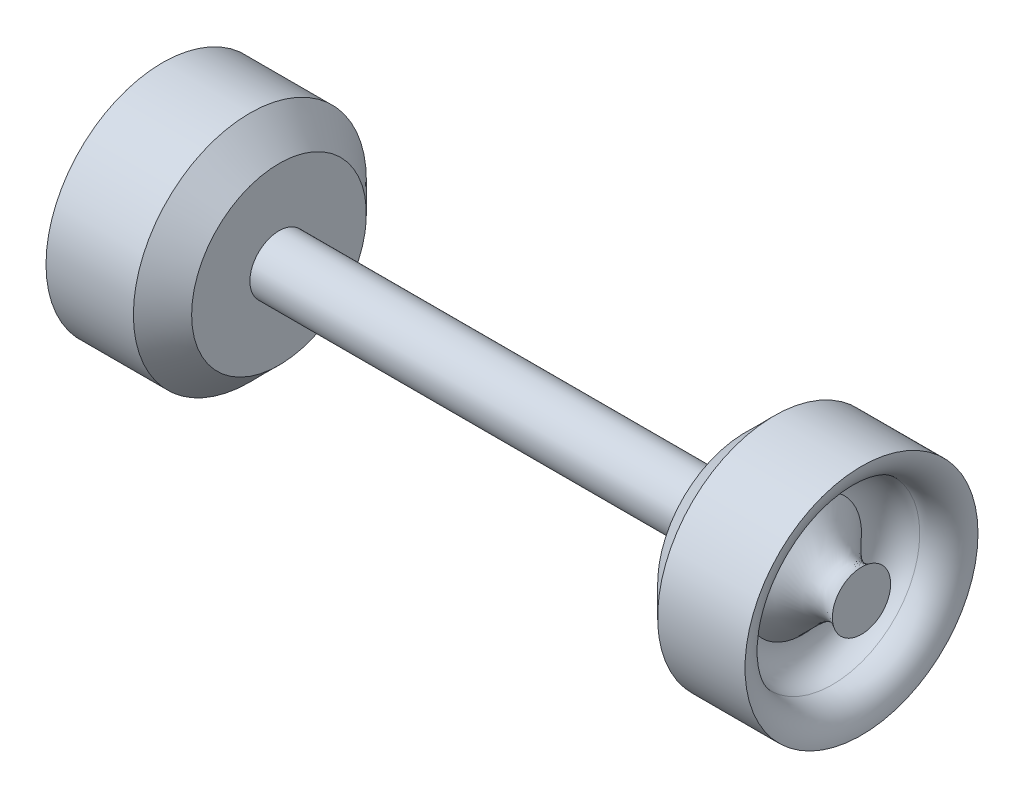
ISO-10303-21;
HEADER;
FILE_DESCRIPTION(('STEP AP214'),'2;1');
FILE_NAME('part.step','',(''),(''),'','','');
FILE_SCHEMA(('AUTOMOTIVE_DESIGN { 1 0 10303 214 1 1 1 1 }'));
ENDSEC;
DATA;
#1=APPLICATION_CONTEXT('core data for automotive mechanical design processes');
#2=APPLICATION_PROTOCOL_DEFINITION('international standard','automotive_design',2000,#1);
#3=PRODUCT_CONTEXT('',#1,'mechanical');
#4=PRODUCT('Part','Part','',(#3));
#5=PRODUCT_RELATED_PRODUCT_CATEGORY('part','',(#4));
#6=PRODUCT_DEFINITION_FORMATION('','',#4);
#7=PRODUCT_DEFINITION_CONTEXT('part definition',#1,'design');
#8=PRODUCT_DEFINITION('design','',#6,#7);
#9=PRODUCT_DEFINITION_SHAPE('','',#8);
#10=(LENGTH_UNIT() NAMED_UNIT(*) SI_UNIT(.MILLI.,.METRE.));
#11=(NAMED_UNIT(*) PLANE_ANGLE_UNIT() SI_UNIT($,.RADIAN.));
#12=(NAMED_UNIT(*) SI_UNIT($,.STERADIAN.) SOLID_ANGLE_UNIT());
#13=UNCERTAINTY_MEASURE_WITH_UNIT(LENGTH_MEASURE(1.E-05),#10,'distance_accuracy_value','');
#14=(GEOMETRIC_REPRESENTATION_CONTEXT(3) GLOBAL_UNCERTAINTY_ASSIGNED_CONTEXT((#13)) GLOBAL_UNIT_ASSIGNED_CONTEXT((#10,
#11,#12)) REPRESENTATION_CONTEXT('',''));
#15=CARTESIAN_POINT('',(0.,0.,0.));
#16=DIRECTION('',(0.,0.,1.));
#17=DIRECTION('',(1.,0.,0.));
#18=AXIS2_PLACEMENT_3D('',#15,#16,#17);
#19=CARTESIAN_POINT('',(20.,0.,0.));
#20=DIRECTION('',(-1.,0.,0.));
#21=DIRECTION('',(0.,0.,1.));
#22=AXIS2_PLACEMENT_3D('',#19,#20,#21);
#23=CYLINDRICAL_SURFACE('',#22,2.5);
#24=CARTESIAN_POINT('',(20.,0.,0.));
#25=DIRECTION('',(1.,0.,0.));
#26=DIRECTION('',(0.,0.,-1.));
#27=AXIS2_PLACEMENT_3D('',#24,#25,#26);
#28=CIRCLE('',#27,2.5);
#29=CARTESIAN_POINT('',(20.,0.,-2.5));
#30=VERTEX_POINT('',#29);
#31=EDGE_CURVE('E129',#30,#30,#28,.T.);
#32=ORIENTED_EDGE('',*,*,#31,.F.);
#33=EDGE_LOOP('',(#32));
#34=FACE_BOUND('',#33,.T.);
#35=CARTESIAN_POINT('',(-20.,0.,0.));
#36=DIRECTION('',(1.,0.,0.));
#37=DIRECTION('',(0.,0.,-1.));
#38=AXIS2_PLACEMENT_3D('',#35,#36,#37);
#39=CIRCLE('',#38,2.5);
#40=CARTESIAN_POINT('',(-20.,0.,-2.5));
#41=VERTEX_POINT('',#40);
#42=EDGE_CURVE('E140',#41,#41,#39,.T.);
#43=ORIENTED_EDGE('',*,*,#42,.T.);
#44=EDGE_LOOP('',(#43));
#45=FACE_BOUND('',#44,.T.);
#46=ADVANCED_FACE('F36',(#34,#45),#23,.T.);
#47=CARTESIAN_POINT('',(30.,0.,0.));
#48=DIRECTION('',(-1.,0.,0.));
#49=DIRECTION('',(0.,0.,1.));
#50=AXIS2_PLACEMENT_3D('',#47,#48,#49);
#51=CYLINDRICAL_SURFACE('',#50,10.);
#52=CARTESIAN_POINT('',(22.5,0.,0.));
#53=DIRECTION('',(1.,0.,0.));
#54=DIRECTION('',(0.,0.,-1.));
#55=AXIS2_PLACEMENT_3D('',#52,#53,#54);
#56=CIRCLE('',#55,10.);
#57=CARTESIAN_POINT('',(22.5,0.,-10.));
#58=VERTEX_POINT('',#57);
#59=EDGE_CURVE('E43',#58,#58,#56,.T.);
#60=ORIENTED_EDGE('',*,*,#59,.T.);
#61=EDGE_LOOP('',(#60));
#62=FACE_BOUND('',#61,.T.);
#63=CARTESIAN_POINT('',(30.,0.,0.));
#64=DIRECTION('',(1.,0.,0.));
#65=DIRECTION('',(0.,0.,-1.));
#66=AXIS2_PLACEMENT_3D('',#63,#64,#65);
#67=CIRCLE('',#66,10.);
#68=CARTESIAN_POINT('',(30.,0.,-10.));
#69=VERTEX_POINT('',#68);
#70=EDGE_CURVE('E132',#69,#69,#67,.T.);
#71=ORIENTED_EDGE('',*,*,#70,.F.);
#72=EDGE_LOOP('',(#71));
#73=FACE_BOUND('',#72,.T.);
#74=ADVANCED_FACE('F88',(#62,#73),#51,.T.);
#75=CARTESIAN_POINT('',(20.,0.,0.));
#76=DIRECTION('',(1.,0.,0.));
#77=DIRECTION('',(0.,0.,-1.));
#78=AXIS2_PLACEMENT_3D('',#75,#76,#77);
#79=PLANE('',#78);
#80=CARTESIAN_POINT('',(20.,0.,0.));
#81=DIRECTION('',(1.,0.,0.));
#82=DIRECTION('',(0.,0.,-1.));
#83=AXIS2_PLACEMENT_3D('',#80,#81,#82);
#84=CIRCLE('',#83,7.49999999999997);
#85=CARTESIAN_POINT('',(20.,0.,-7.49999999999997));
#86=VERTEX_POINT('',#85);
#87=EDGE_CURVE('E11',#86,#86,#84,.F.);
#88=ORIENTED_EDGE('',*,*,#87,.T.);
#89=EDGE_LOOP('',(#88));
#90=FACE_BOUND('',#89,.T.);
#91=ORIENTED_EDGE('',*,*,#31,.T.);
#92=EDGE_LOOP('',(#91));
#93=FACE_BOUND('',#92,.T.);
#94=ADVANCED_FACE('F94',(#90,#93),#79,.F.);
#95=CARTESIAN_POINT('',(30.,0.,0.));
#96=DIRECTION('',(1.,0.,0.));
#97=DIRECTION('',(0.,0.,-1.));
#98=AXIS2_PLACEMENT_3D('',#95,#96,#97);
#99=PLANE('',#98);
#100=CARTESIAN_POINT('',(30.,0.,0.));
#101=DIRECTION('',(1.,0.,0.));
#102=DIRECTION('',(0.,0.,-1.));
#103=AXIS2_PLACEMENT_3D('',#100,#101,#102);
#104=CIRCLE('',#103,2.5);
#105=CARTESIAN_POINT('',(30.,2.33916485240125,0.882217543064436));
#106=VERTEX_POINT('',#105);
#107=EDGE_CURVE('E135',#106,#106,#104,.T.);
#108=ORIENTED_EDGE('',*,*,#107,.T.);
#109=EDGE_LOOP('',(#108));
#110=FACE_BOUND('',#109,.T.);
#111=ADVANCED_FACE('F146',(#110),#99,.T.);
#112=CARTESIAN_POINT('',(30.,2.33916485240125,0.882217543064436));
#113=CARTESIAN_POINT('',(25.,0.918384280565023,-4.91493339865466));
#114=CARTESIAN_POINT('',(30.,4.10359993853012,-3.79611216173806));
#115=CARTESIAN_POINT('',(25.,-8.9114825167443,-6.75170195978471));
#116=CARTESIAN_POINT('',(30.,-0.574729766272376,-5.56054724786693));
#117=CARTESIAN_POINT('',(25.,-10.7482510778743,3.07816483752462));
#118=CARTESIAN_POINT('',(30.,-2.33916485240125,-0.882217543064436));
#119=CARTESIAN_POINT('',(25.,-0.918384280565022,4.91493339865466));
#120=CARTESIAN_POINT('',(30.,-4.10359993853012,3.79611216173806));
#121=CARTESIAN_POINT('',(25.,8.9114825167443,6.75170195978471));
#122=CARTESIAN_POINT('',(30.,0.574729766272374,5.56054724786693));
#123=CARTESIAN_POINT('',(25.,10.7482510778743,-3.07816483752462));
#124=CARTESIAN_POINT('',(30.,2.33916485240125,0.882217543064436));
#125=CARTESIAN_POINT('',(25.,0.918384280565023,-4.91493339865466));
#126=(BOUNDED_SURFACE() B_SPLINE_SURFACE(3,1,((#112,#113),(#114,#115),(#116,#117),(#118,#119),
(#120,#121),(#122,#123),(#124,#125)),.UNSPECIFIED.,.T.,.F.,.F.) B_SPLINE_SURFACE_WITH_KNOTS((4,
3,4),(2,2),(0.,0.5,1.),(0.,1.),
.UNSPECIFIED.) GEOMETRIC_REPRESENTATION_ITEM() RATIONAL_B_SPLINE_SURFACE(((1.,1.),
(0.333333333333333,0.333333333333333),(0.333333333333333,0.333333333333333),(1.,1.),
(0.333333333333334,0.333333333333333),(0.333333333333334,0.333333333333333),(1.,1.))) REPRESENTATION_ITEM('') SURFACE());
#127=CARTESIAN_POINT('',(25.,0.,0.));
#128=DIRECTION('',(-1.,0.,0.));
#129=DIRECTION('',(0.,0.,1.));
#130=AXIS2_PLACEMENT_3D('',#127,#128,#129);
#131=CIRCLE('',#130,5.);
#132=CARTESIAN_POINT('',(25.,0.918384280565023,-4.91493339865466));
#133=VERTEX_POINT('',#132);
#134=EDGE_CURVE('E115',#133,#133,#131,.F.);
#135=CARTESIAN_POINT('',(30.,2.33916485240125,0.882217543064436));
#136=CARTESIAN_POINT('',(29.9479166666667,2.32436505477795,0.821830554088195));
#137=CARTESIAN_POINT('',(29.8958333333333,2.30956525715466,0.761443565111955));
#138=CARTESIAN_POINT('',(29.7916666666667,2.27996566190807,0.640669587159474));
#139=CARTESIAN_POINT('',(29.7395833333333,2.26516586428478,0.580282598183233));
#140=CARTESIAN_POINT('',(29.6354166666667,2.23556626903819,0.459508620230752));
#141=CARTESIAN_POINT('',(29.5833333333333,2.2207664714149,0.399121631254511));
#142=CARTESIAN_POINT('',(29.4791666666667,2.19116687616831,0.27834765330203));
#143=CARTESIAN_POINT('',(29.4270833333333,2.17636707854501,0.217960664325789));
#144=CARTESIAN_POINT('',(29.3229166666667,2.14676748329843,0.0971866863733083));
#145=CARTESIAN_POINT('',(29.2708333333333,2.13196768567513,0.0367996973970679));
#146=CARTESIAN_POINT('',(29.1666666666667,2.10236809042854,-0.0839742805554133));
#147=CARTESIAN_POINT('',(29.1145833333333,2.08756829280525,-0.144361269531654));
#148=CARTESIAN_POINT('',(29.0104166666667,2.05796869755866,-0.265135247484136));
#149=CARTESIAN_POINT('',(28.9583333333333,2.04316889993537,-0.325522236460377));
#150=CARTESIAN_POINT('',(28.8541666666667,2.01356930468878,-0.446296214412857));
#151=CARTESIAN_POINT('',(28.8020833333333,1.99876950706549,-0.506683203389098));
#152=CARTESIAN_POINT('',(28.6979166666667,1.9691699118189,-0.627457181341579));
#153=CARTESIAN_POINT('',(28.6458333333333,1.9543701141956,-0.68784417031782));
#154=CARTESIAN_POINT('',(28.5416666666667,1.92477051894902,-0.808618148270301));
#155=CARTESIAN_POINT('',(28.4895833333333,1.90997072132572,-0.869005137246541));
#156=CARTESIAN_POINT('',(28.3854166666667,1.88037112607913,-0.989779115199023));
#157=CARTESIAN_POINT('',(28.3333333333333,1.86557132845584,-1.05016610417526));
#158=CARTESIAN_POINT('',(28.2291666666667,1.83597173320925,-1.17094008212774));
#159=CARTESIAN_POINT('',(28.1770833333333,1.82117193558596,-1.23132707110398));
#160=CARTESIAN_POINT('',(28.0729166666667,1.79157234033937,-1.35210104905647));
#161=CARTESIAN_POINT('',(28.0208333333333,1.77677254271608,-1.41248803803271));
#162=CARTESIAN_POINT('',(27.9166666666667,1.74717294746949,-1.53326201598519));
#163=CARTESIAN_POINT('',(27.8645833333333,1.73237314984619,-1.59364900496143));
#164=CARTESIAN_POINT('',(27.7604166666667,1.7027735545996,-1.71442298291391));
#165=CARTESIAN_POINT('',(27.7083333333333,1.68797375697631,-1.77480997189015));
#166=CARTESIAN_POINT('',(27.6041666666667,1.65837416172972,-1.89558394984263));
#167=CARTESIAN_POINT('',(27.5520833333333,1.64357436410643,-1.95597093881887));
#168=CARTESIAN_POINT('',(27.4479166666667,1.61397476885984,-2.07674491677135));
#169=CARTESIAN_POINT('',(27.3958333333333,1.59917497123655,-2.13713190574759));
#170=CARTESIAN_POINT('',(27.2916666666667,1.56957537598996,-2.25790588370008));
#171=CARTESIAN_POINT('',(27.2395833333333,1.55477557836667,-2.31829287267632));
#172=CARTESIAN_POINT('',(27.1354166666667,1.52517598312008,-2.4390668506288));
#173=CARTESIAN_POINT('',(27.0833333333333,1.51037618549678,-2.49945383960504));
#174=CARTESIAN_POINT('',(26.9791666666667,1.48077659025019,-2.62022781755752));
#175=CARTESIAN_POINT('',(26.9270833333333,1.4659767926269,-2.68061480653376));
#176=CARTESIAN_POINT('',(26.8229166666667,1.43637719738031,-2.80138878448624));
#177=CARTESIAN_POINT('',(26.7708333333333,1.42157739975702,-2.86177577346248));
#178=CARTESIAN_POINT('',(26.6666666666667,1.39197780451043,-2.98254975141496));
#179=CARTESIAN_POINT('',(26.6145833333333,1.37717800688714,-3.0429367403912));
#180=CARTESIAN_POINT('',(26.5104166666667,1.34757841164055,-3.16371071834368));
#181=CARTESIAN_POINT('',(26.4583333333333,1.33277861401726,-3.22409770731993));
#182=CARTESIAN_POINT('',(26.3541666666667,1.30317901877067,-3.34487168527241));
#183=CARTESIAN_POINT('',(26.3020833333333,1.28837922114737,-3.40525867424865));
#184=CARTESIAN_POINT('',(26.1979166666667,1.25877962590079,-3.52603265220113));
#185=CARTESIAN_POINT('',(26.1458333333333,1.24397982827749,-3.58641964117737));
#186=CARTESIAN_POINT('',(26.0416666666667,1.2143802330309,-3.70719361912985));
#187=CARTESIAN_POINT('',(25.9895833333333,1.19958043540761,-3.76758060810609));
#188=CARTESIAN_POINT('',(25.8854166666667,1.16998084016102,-3.88835458605857));
#189=CARTESIAN_POINT('',(25.8333333333333,1.15518104253773,-3.94874157503481));
#190=CARTESIAN_POINT('',(25.7291666666667,1.12558144729114,-4.06951555298729));
#191=CARTESIAN_POINT('',(25.6770833333333,1.11078164966785,-4.12990254196353));
#192=CARTESIAN_POINT('',(25.5729166666667,1.08118205442126,-4.25067651991601));
#193=CARTESIAN_POINT('',(25.5208333333333,1.06638225679796,-4.31106350889226));
#194=CARTESIAN_POINT('',(25.4166666666667,1.03678266155138,-4.43183748684474));
#195=CARTESIAN_POINT('',(25.3645833333333,1.02198286392808,-4.49222447582098));
#196=CARTESIAN_POINT('',(25.2604166666667,0.992383268681493,-4.61299845377346));
#197=CARTESIAN_POINT('',(25.2083333333333,0.977583471058199,-4.6733854427497));
#198=CARTESIAN_POINT('',(25.1041666666667,0.947983875811611,-4.79415942070218));
#199=CARTESIAN_POINT('',(25.0520833333333,0.933184078188317,-4.85454640967842));
#200=CARTESIAN_POINT('',(25.,0.918384280565023,-4.91493339865466));
#201=B_SPLINE_CURVE_WITH_KNOTS('',3,(#135,#136,#137,#138,#139,#140,#141,#142,#143,#144,#145,
#146,#147,#148,#149,#150,#151,#152,#153,#154,#155,#156,#157,#158,#159,#160,#161,#162,#163,#164,
#165,#166,#167,#168,#169,#170,#171,#172,#173,#174,#175,#176,#177,#178,#179,#180,#181,#182,#183,
#184,#185,#186,#187,#188,#189,#190,#191,#192,#193,#194,#195,#196,#197,#198,#199,#200),
.UNSPECIFIED.,.F.,.F.,(4,2,2,2,2,2,2,2,2,2,2,2,2,2,2,2,2,2,2,2,2,2,2,2,2,2,2,2,2,2,2,2,4),(0.,
0.243320086564516,0.486640173129032,0.729960259693548,0.973280346258064,1.21660043282258,
1.45992051938709,1.70324060595161,1.94656069251613,2.18988077908065,2.43320086564516,
2.67652095220968,2.91984103877419,3.16316112533871,3.40648121190322,3.64980129846774,
3.89312138503226,4.13644147159677,4.37976155816129,4.6230816447258,4.86640173129032,
5.10972181785484,5.35304190441935,5.59636199098387,5.83968207754838,6.0830021641129,
6.32632225067742,6.56964233724193,6.81296242380645,7.05628251037096,7.29960259693548,
7.5429226835,7.78624277006451),.UNSPECIFIED.);
#202=EDGE_CURVE('BSEAM156',#106,#133,#201,.T.);
#203=ORIENTED_EDGE('',*,*,#107,.F.);
#204=ORIENTED_EDGE('',*,*,#134,.T.);
#205=ORIENTED_EDGE('',*,*,#202,.T.);
#206=ORIENTED_EDGE('',*,*,#202,.F.);
#207=EDGE_LOOP('',(#203,#205,#204,#206));
#208=FACE_BOUND('',#207,.T.);
#209=ADVANCED_FACE('F156',(#208),#126,.T.);
#210=CARTESIAN_POINT('',(-30.,0.,0.));
#211=DIRECTION('',(1.,0.,0.));
#212=DIRECTION('',(0.,0.,-1.));
#213=AXIS2_PLACEMENT_3D('',#210,#211,#212);
#214=CYLINDRICAL_SURFACE('',#213,10.);
#215=CARTESIAN_POINT('',(-22.5,0.,0.));
#216=DIRECTION('',(-1.,0.,0.));
#217=DIRECTION('',(0.,0.,1.));
#218=AXIS2_PLACEMENT_3D('',#215,#216,#217);
#219=CIRCLE('',#218,10.);
#220=CARTESIAN_POINT('',(-22.5,0.,10.));
#221=VERTEX_POINT('',#220);
#222=EDGE_CURVE('E47',#221,#221,#219,.T.);
#223=ORIENTED_EDGE('',*,*,#222,.T.);
#224=EDGE_LOOP('',(#223));
#225=FACE_BOUND('',#224,.T.);
#226=CARTESIAN_POINT('',(-30.,0.,0.));
#227=DIRECTION('',(1.,0.,0.));
#228=DIRECTION('',(0.,0.,-1.));
#229=AXIS2_PLACEMENT_3D('',#226,#227,#228);
#230=CIRCLE('',#229,10.);
#231=CARTESIAN_POINT('',(-30.,0.,-10.));
#232=VERTEX_POINT('',#231);
#233=EDGE_CURVE('E124',#232,#232,#230,.T.);
#234=ORIENTED_EDGE('',*,*,#233,.T.);
#235=EDGE_LOOP('',(#234));
#236=FACE_BOUND('',#235,.T.);
#237=ADVANCED_FACE('F158',(#225,#236),#214,.T.);
#238=CARTESIAN_POINT('',(-20.,0.,0.));
#239=DIRECTION('',(-1.,0.,0.));
#240=DIRECTION('',(0.,0.,-1.));
#241=AXIS2_PLACEMENT_3D('',#238,#239,#240);
#242=PLANE('',#241);
#243=CARTESIAN_POINT('',(-20.,0.,0.));
#244=DIRECTION('',(-1.,0.,0.));
#245=DIRECTION('',(0.,0.,1.));
#246=AXIS2_PLACEMENT_3D('',#243,#244,#245);
#247=CIRCLE('',#246,7.5);
#248=CARTESIAN_POINT('',(-20.,0.,7.5));
#249=VERTEX_POINT('',#248);
#250=EDGE_CURVE('E51',#249,#249,#247,.F.);
#251=ORIENTED_EDGE('',*,*,#250,.T.);
#252=EDGE_LOOP('',(#251));
#253=FACE_BOUND('',#252,.T.);
#254=ORIENTED_EDGE('',*,*,#42,.F.);
#255=EDGE_LOOP('',(#254));
#256=FACE_BOUND('',#255,.T.);
#257=ADVANCED_FACE('F199',(#253,#256),#242,.F.);
#258=CARTESIAN_POINT('',(-30.,0.,0.));
#259=DIRECTION('',(-1.,0.,0.));
#260=DIRECTION('',(0.,0.,-1.));
#261=AXIS2_PLACEMENT_3D('',#258,#259,#260);
#262=PLANE('',#261);
#263=CARTESIAN_POINT('',(-30.,0.,0.));
#264=DIRECTION('',(1.,0.,0.));
#265=DIRECTION('',(0.,0.,-1.));
#266=AXIS2_PLACEMENT_3D('',#263,#264,#265);
#267=CIRCLE('',#266,2.5);
#268=CARTESIAN_POINT('',(-30.,0.,-2.5));
#269=VERTEX_POINT('',#268);
#270=EDGE_CURVE('E120',#269,#269,#267,.T.);
#271=ORIENTED_EDGE('',*,*,#270,.F.);
#272=EDGE_LOOP('',(#271));
#273=FACE_BOUND('',#272,.T.);
#274=ADVANCED_FACE('F109',(#273),#262,.T.);
#275=CARTESIAN_POINT('',(-30.,2.33916485240125,0.882217543064436));
#276=CARTESIAN_POINT('',(-25.,0.918384280565023,-4.91493339865466));
#277=CARTESIAN_POINT('',(-30.,4.10359993853012,-3.79611216173806));
#278=CARTESIAN_POINT('',(-25.,-8.9114825167443,-6.75170195978471));
#279=CARTESIAN_POINT('',(-30.,-0.574729766272376,-5.56054724786693));
#280=CARTESIAN_POINT('',(-25.,-10.7482510778743,3.07816483752462));
#281=CARTESIAN_POINT('',(-30.,-2.33916485240125,-0.882217543064436));
#282=CARTESIAN_POINT('',(-25.,-0.918384280565022,4.91493339865466));
#283=CARTESIAN_POINT('',(-30.,-4.10359993853012,3.79611216173806));
#284=CARTESIAN_POINT('',(-25.,8.9114825167443,6.75170195978471));
#285=CARTESIAN_POINT('',(-30.,0.574729766272374,5.56054724786693));
#286=CARTESIAN_POINT('',(-25.,10.7482510778743,-3.07816483752462));
#287=CARTESIAN_POINT('',(-30.,2.33916485240125,0.882217543064436));
#288=CARTESIAN_POINT('',(-25.,0.918384280565023,-4.91493339865466));
#289=(BOUNDED_SURFACE() B_SPLINE_SURFACE(3,1,((#275,#276),(#277,#278),(#279,#280),(#281,#282),
(#283,#284),(#285,#286),(#287,#288)),.UNSPECIFIED.,.T.,.F.,.F.) B_SPLINE_SURFACE_WITH_KNOTS((4,
3,4),(2,2),(0.,0.5,1.),(0.,1.),
.UNSPECIFIED.) GEOMETRIC_REPRESENTATION_ITEM() RATIONAL_B_SPLINE_SURFACE(((1.,1.),
(0.333333333333333,0.333333333333333),(0.333333333333333,0.333333333333333),(1.,1.),
(0.333333333333334,0.333333333333333),(0.333333333333334,0.333333333333333),(1.,1.))) REPRESENTATION_ITEM('') SURFACE());
#290=CARTESIAN_POINT('',(-25.,0.918384280565023,-4.91493339865466));
#291=CARTESIAN_POINT('',(-25.,-8.9114825167443,-6.75170195978471));
#292=CARTESIAN_POINT('',(-25.,-10.7482510778743,3.07816483752462));
#293=CARTESIAN_POINT('',(-25.,-0.918384280565022,4.91493339865466));
#294=CARTESIAN_POINT('',(-25.,8.9114825167443,6.75170195978471));
#295=CARTESIAN_POINT('',(-25.,10.7482510778743,-3.07816483752462));
#296=CARTESIAN_POINT('',(-25.,0.918384280565023,-4.91493339865466));
#297=(BOUNDED_CURVE() B_SPLINE_CURVE(3,(#290,#291,#292,#293,#294,#295,#296),.UNSPECIFIED.,.T.,
.F.) B_SPLINE_CURVE_WITH_KNOTS((4,3,4),(0.,0.5,1.),
.UNSPECIFIED.) CURVE() GEOMETRIC_REPRESENTATION_ITEM() RATIONAL_B_SPLINE_CURVE((1.,
0.333333333333333,0.333333333333333,1.,0.333333333333333,0.333333333333333,1.)) REPRESENTATION_ITEM(''));
#298=CARTESIAN_POINT('',(-25.,5.,0.));
#299=VERTEX_POINT('',#298);
#300=EDGE_CURVE('E56',#299,#299,#297,.T.);
#301=ORIENTED_EDGE('',*,*,#270,.T.);
#302=EDGE_LOOP('',(#301));
#303=FACE_BOUND('',#302,.T.);
#304=ORIENTED_EDGE('',*,*,#300,.T.);
#305=EDGE_LOOP('',(#304));
#306=FACE_BOUND('',#305,.T.);
#307=ADVANCED_FACE('F104',(#303,#306),#289,.F.);
#308=CARTESIAN_POINT('',(27.5,0.,0.));
#309=DIRECTION('',(1.,0.,0.));
#310=DIRECTION('',(0.,0.,-1.));
#311=AXIS2_PLACEMENT_3D('',#308,#309,#310);
#312=TOROIDAL_SURFACE('',#311,5.,2.5);
#313=ORIENTED_EDGE('',*,*,#134,.F.);
#314=EDGE_LOOP('',(#313));
#315=FACE_BOUND('',#314,.T.);
#316=CARTESIAN_POINT('',(27.5,0.,0.));
#317=DIRECTION('',(1.,0.,0.));
#318=DIRECTION('',(0.,0.,-1.));
#319=AXIS2_PLACEMENT_3D('',#316,#317,#318);
#320=CIRCLE('',#319,7.5);
#321=CARTESIAN_POINT('',(27.5,0.,-7.5));
#322=VERTEX_POINT('',#321);
#323=EDGE_CURVE('E118',#322,#322,#320,.F.);
#324=ORIENTED_EDGE('',*,*,#323,.F.);
#325=EDGE_LOOP('',(#324));
#326=FACE_BOUND('',#325,.T.);
#327=ADVANCED_FACE('F101',(#315,#326),#312,.F.);
#328=CARTESIAN_POINT('',(27.5,0.,0.));
#329=DIRECTION('',(1.,0.,0.));
#330=DIRECTION('',(0.,0.,-1.));
#331=AXIS2_PLACEMENT_3D('',#328,#329,#330);
#332=TOROIDAL_SURFACE('',#331,10.,2.5);
#333=ORIENTED_EDGE('',*,*,#70,.T.);
#334=EDGE_LOOP('',(#333));
#335=FACE_BOUND('',#334,.T.);
#336=ORIENTED_EDGE('',*,*,#323,.T.);
#337=EDGE_LOOP('',(#336));
#338=FACE_BOUND('',#337,.T.);
#339=ADVANCED_FACE('F73',(#335,#338),#332,.T.);
#340=CARTESIAN_POINT('',(-27.5,0.,0.));
#341=DIRECTION('',(-1.,0.,0.));
#342=DIRECTION('',(0.,0.,1.));
#343=AXIS2_PLACEMENT_3D('',#340,#341,#342);
#344=TOROIDAL_SURFACE('',#343,5.,2.5);
#345=ORIENTED_EDGE('',*,*,#300,.F.);
#346=EDGE_LOOP('',(#345));
#347=FACE_BOUND('',#346,.T.);
#348=CARTESIAN_POINT('',(-27.5,0.,0.));
#349=DIRECTION('',(-1.,0.,0.));
#350=DIRECTION('',(0.,0.,1.));
#351=AXIS2_PLACEMENT_3D('',#348,#349,#350);
#352=CIRCLE('',#351,7.5);
#353=CARTESIAN_POINT('',(-27.5,0.,7.5));
#354=VERTEX_POINT('',#353);
#355=EDGE_CURVE('E121',#354,#354,#352,.F.);
#356=ORIENTED_EDGE('',*,*,#355,.F.);
#357=EDGE_LOOP('',(#356));
#358=FACE_BOUND('',#357,.T.);
#359=ADVANCED_FACE('F63',(#347,#358),#344,.F.);
#360=CARTESIAN_POINT('',(-27.5,0.,0.));
#361=DIRECTION('',(-1.,0.,0.));
#362=DIRECTION('',(0.,0.,1.));
#363=AXIS2_PLACEMENT_3D('',#360,#361,#362);
#364=TOROIDAL_SURFACE('',#363,10.,2.5);
#365=ORIENTED_EDGE('',*,*,#355,.T.);
#366=EDGE_LOOP('',(#365));
#367=FACE_BOUND('',#366,.T.);
#368=ORIENTED_EDGE('',*,*,#233,.F.);
#369=EDGE_LOOP('',(#368));
#370=FACE_BOUND('',#369,.T.);
#371=ADVANCED_FACE('F72',(#367,#370),#364,.T.);
#372=CARTESIAN_POINT('',(-20.,0.,0.));
#373=DIRECTION('',(-1.,0.,0.));
#374=DIRECTION('',(0.,0.,1.));
#375=AXIS2_PLACEMENT_3D('',#372,#373,#374);
#376=CONICAL_SURFACE('',#375,7.5,0.785398163397447);
#377=ORIENTED_EDGE('',*,*,#222,.F.);
#378=EDGE_LOOP('',(#377));
#379=FACE_BOUND('',#378,.T.);
#380=ORIENTED_EDGE('',*,*,#250,.F.);
#381=EDGE_LOOP('',(#380));
#382=FACE_BOUND('',#381,.T.);
#383=ADVANCED_FACE('F76',(#379,#382),#376,.T.);
#384=CARTESIAN_POINT('',(22.5,0.,0.));
#385=DIRECTION('',(1.,0.,0.));
#386=DIRECTION('',(0.,0.,-1.));
#387=AXIS2_PLACEMENT_3D('',#384,#385,#386);
#388=CONICAL_SURFACE('',#387,10.,0.785398163397451);
#389=CARTESIAN_POINT('',(20.,0.,-7.49999999999997));
#390=CARTESIAN_POINT('',(20.0260416666667,0.,-7.52604166666664));
#391=CARTESIAN_POINT('',(20.0520833333333,0.,-7.5520833333333));
#392=CARTESIAN_POINT('',(20.1041666666667,0.,-7.60416666666664));
#393=CARTESIAN_POINT('',(20.1302083333333,0.,-7.6302083333333));
#394=CARTESIAN_POINT('',(20.1822916666667,0.,-7.68229166666664));
#395=CARTESIAN_POINT('',(20.2083333333333,0.,-7.70833333333331));
#396=CARTESIAN_POINT('',(20.2604166666667,0.,-7.76041666666664));
#397=CARTESIAN_POINT('',(20.2864583333333,0.,-7.78645833333331));
#398=CARTESIAN_POINT('',(20.3385416666667,0.,-7.83854166666664));
#399=CARTESIAN_POINT('',(20.3645833333333,0.,-7.86458333333331));
#400=CARTESIAN_POINT('',(20.4166666666667,0.,-7.91666666666664));
#401=CARTESIAN_POINT('',(20.4427083333333,0.,-7.94270833333331));
#402=CARTESIAN_POINT('',(20.4947916666667,0.,-7.99479166666664));
#403=CARTESIAN_POINT('',(20.5208333333333,0.,-8.02083333333331));
#404=CARTESIAN_POINT('',(20.5729166666667,0.,-8.07291666666664));
#405=CARTESIAN_POINT('',(20.5989583333333,0.,-8.09895833333331));
#406=CARTESIAN_POINT('',(20.6510416666667,0.,-8.15104166666664));
#407=CARTESIAN_POINT('',(20.6770833333333,0.,-8.17708333333331));
#408=CARTESIAN_POINT('',(20.7291666666667,0.,-8.22916666666664));
#409=CARTESIAN_POINT('',(20.7552083333333,0.,-8.25520833333331));
#410=CARTESIAN_POINT('',(20.8072916666667,0.,-8.30729166666665));
#411=CARTESIAN_POINT('',(20.8333333333333,0.,-8.33333333333331));
#412=CARTESIAN_POINT('',(20.8854166666667,0.,-8.38541666666665));
#413=CARTESIAN_POINT('',(20.9114583333333,0.,-8.41145833333331));
#414=CARTESIAN_POINT('',(20.9635416666667,0.,-8.46354166666665));
#415=CARTESIAN_POINT('',(20.9895833333333,0.,-8.48958333333331));
#416=CARTESIAN_POINT('',(21.0416666666667,0.,-8.54166666666665));
#417=CARTESIAN_POINT('',(21.0677083333333,0.,-8.56770833333332));
#418=CARTESIAN_POINT('',(21.1197916666667,0.,-8.61979166666665));
#419=CARTESIAN_POINT('',(21.1458333333333,0.,-8.64583333333332));
#420=CARTESIAN_POINT('',(21.1979166666667,0.,-8.69791666666665));
#421=CARTESIAN_POINT('',(21.2239583333333,0.,-8.72395833333332));
#422=CARTESIAN_POINT('',(21.2760416666667,0.,-8.77604166666665));
#423=CARTESIAN_POINT('',(21.3020833333333,0.,-8.80208333333332));
#424=CARTESIAN_POINT('',(21.3541666666667,0.,-8.85416666666665));
#425=CARTESIAN_POINT('',(21.3802083333333,0.,-8.88020833333332));
#426=CARTESIAN_POINT('',(21.4322916666667,0.,-8.93229166666665));
#427=CARTESIAN_POINT('',(21.4583333333333,0.,-8.95833333333332));
#428=CARTESIAN_POINT('',(21.5104166666667,0.,-9.01041666666665));
#429=CARTESIAN_POINT('',(21.5364583333333,0.,-9.03645833333332));
#430=CARTESIAN_POINT('',(21.5885416666667,0.,-9.08854166666665));
#431=CARTESIAN_POINT('',(21.6145833333333,0.,-9.11458333333332));
#432=CARTESIAN_POINT('',(21.6666666666667,0.,-9.16666666666666));
#433=CARTESIAN_POINT('',(21.6927083333333,0.,-9.19270833333332));
#434=CARTESIAN_POINT('',(21.7447916666667,0.,-9.24479166666666));
#435=CARTESIAN_POINT('',(21.7708333333333,0.,-9.27083333333332));
#436=CARTESIAN_POINT('',(21.8229166666667,0.,-9.32291666666666));
#437=CARTESIAN_POINT('',(21.8489583333333,0.,-9.34895833333332));
#438=CARTESIAN_POINT('',(21.9010416666667,0.,-9.40104166666666));
#439=CARTESIAN_POINT('',(21.9270833333333,0.,-9.42708333333333));
#440=CARTESIAN_POINT('',(21.9791666666667,0.,-9.47916666666666));
#441=CARTESIAN_POINT('',(22.0052083333333,0.,-9.50520833333333));
#442=CARTESIAN_POINT('',(22.0572916666667,0.,-9.55729166666666));
#443=CARTESIAN_POINT('',(22.0833333333333,0.,-9.58333333333333));
#444=CARTESIAN_POINT('',(22.1354166666667,0.,-9.63541666666666));
#445=CARTESIAN_POINT('',(22.1614583333333,0.,-9.66145833333333));
#446=CARTESIAN_POINT('',(22.2135416666667,0.,-9.71354166666666));
#447=CARTESIAN_POINT('',(22.2395833333333,0.,-9.73958333333333));
#448=CARTESIAN_POINT('',(22.2916666666667,0.,-9.79166666666666));
#449=CARTESIAN_POINT('',(22.3177083333333,0.,-9.81770833333333));
#450=CARTESIAN_POINT('',(22.3697916666667,0.,-9.86979166666666));
#451=CARTESIAN_POINT('',(22.3958333333333,0.,-9.89583333333333));
#452=CARTESIAN_POINT('',(22.4479166666667,0.,-9.94791666666666));
#453=CARTESIAN_POINT('',(22.4739583333333,0.,-9.97395833333333));
#454=CARTESIAN_POINT('',(22.5,0.,-10.));
#455=B_SPLINE_CURVE_WITH_KNOTS('',3,(#389,#390,#391,#392,#393,#394,#395,#396,#397,#398,#399,
#400,#401,#402,#403,#404,#405,#406,#407,#408,#409,#410,#411,#412,#413,#414,#415,#416,#417,#418,
#419,#420,#421,#422,#423,#424,#425,#426,#427,#428,#429,#430,#431,#432,#433,#434,#435,#436,#437,
#438,#439,#440,#441,#442,#443,#444,#445,#446,#447,#448,#449,#450,#451,#452,#453,#454),
.UNSPECIFIED.,.F.,.F.,(4,2,2,2,2,2,2,2,2,2,2,2,2,2,2,2,2,2,2,2,2,2,2,2,2,2,2,2,2,2,2,2,4),(0.,
0.110485434560398,0.220970869120798,0.331456303681195,0.441941738241595,0.552427172801994,
0.662912607362393,0.773398041922792,0.88388347648319,0.99436891104359,1.10485434560399,
1.21533978016439,1.32582521472479,1.43631064928518,1.54679608384559,1.65728151840598,
1.76776695296638,1.87825238752678,1.98873782208718,2.09922325664758,2.20970869120798,
2.32019412576838,2.43067956032878,2.54116499488918,2.65165042944957,2.76213586400997,
2.87262129857037,2.98310673313077,3.09359216769117,3.20407760225157,3.31456303681197,
3.42504847137237,3.53553390593277),.UNSPECIFIED.);
#456=EDGE_CURVE('BSEAM38',#86,#58,#455,.T.);
#457=ORIENTED_EDGE('',*,*,#87,.F.);
#458=ORIENTED_EDGE('',*,*,#59,.F.);
#459=ORIENTED_EDGE('',*,*,#456,.T.);
#460=ORIENTED_EDGE('',*,*,#456,.F.);
#461=EDGE_LOOP('',(#457,#459,#458,#460));
#462=FACE_BOUND('',#461,.T.);
#463=ADVANCED_FACE('F38',(#462),#388,.T.);
#464=CLOSED_SHELL('',(#46,#74,#94,#111,#209,#237,#257,#274,#307,#327,#339,#359,#371,#383,#463));
#465=MANIFOLD_SOLID_BREP('B2',#464);
#466=ADVANCED_BREP_SHAPE_REPRESENTATION('',(#18,#465),#14);
#467=SHAPE_DEFINITION_REPRESENTATION(#9,#466);
ENDSEC;
END-ISO-10303-21;
